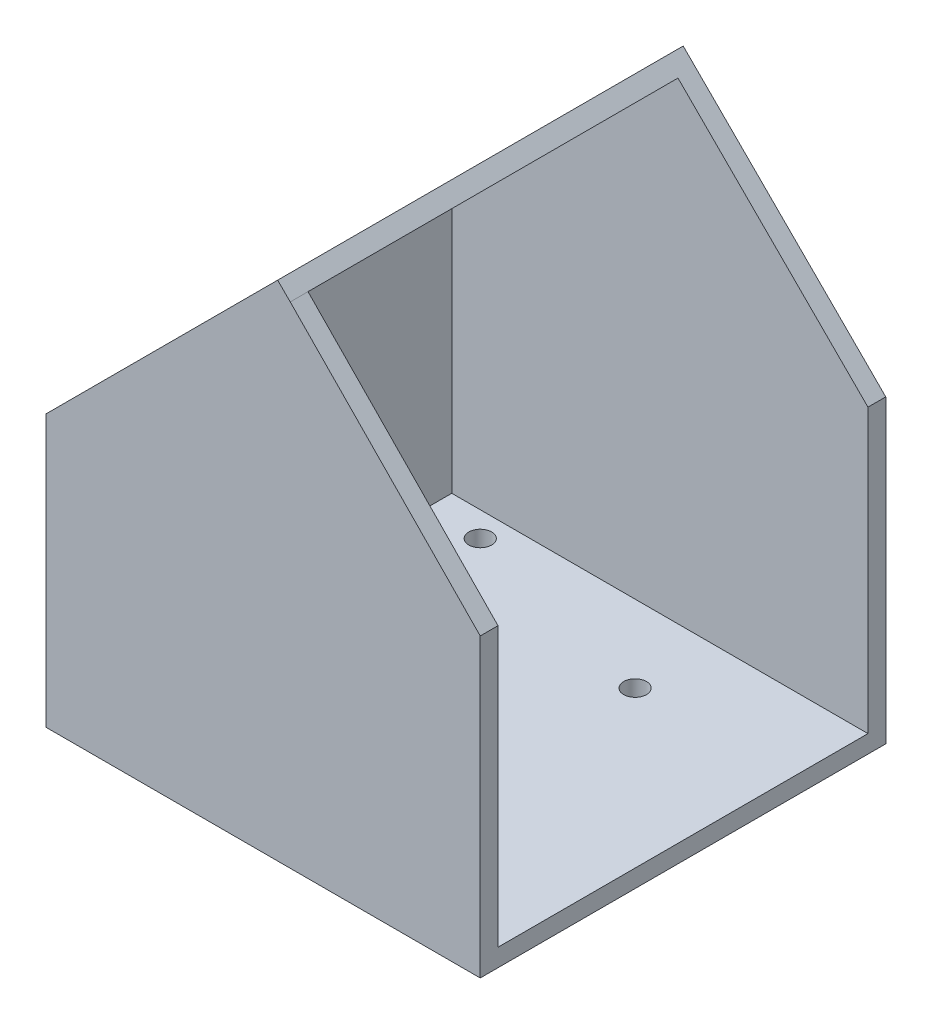
ISO-10303-21;
HEADER;
FILE_DESCRIPTION(('STEP AP214'),'2;1');
FILE_NAME('part.step','',(''),(''),'','','');
FILE_SCHEMA(('AUTOMOTIVE_DESIGN { 1 0 10303 214 1 1 1 1 }'));
ENDSEC;
DATA;
#1=APPLICATION_CONTEXT('core data for automotive mechanical design processes');
#2=APPLICATION_PROTOCOL_DEFINITION('international standard','automotive_design',2000,#1);
#3=PRODUCT_CONTEXT('',#1,'mechanical');
#4=PRODUCT('Part','Part','',(#3));
#5=PRODUCT_RELATED_PRODUCT_CATEGORY('part','',(#4));
#6=PRODUCT_DEFINITION_FORMATION('','',#4);
#7=PRODUCT_DEFINITION_CONTEXT('part definition',#1,'design');
#8=PRODUCT_DEFINITION('design','',#6,#7);
#9=PRODUCT_DEFINITION_SHAPE('','',#8);
#10=(LENGTH_UNIT() NAMED_UNIT(*) SI_UNIT(.MILLI.,.METRE.));
#11=(NAMED_UNIT(*) PLANE_ANGLE_UNIT() SI_UNIT($,.RADIAN.));
#12=(NAMED_UNIT(*) SI_UNIT($,.STERADIAN.) SOLID_ANGLE_UNIT());
#13=UNCERTAINTY_MEASURE_WITH_UNIT(LENGTH_MEASURE(1.E-05),#10,'distance_accuracy_value','');
#14=(GEOMETRIC_REPRESENTATION_CONTEXT(3) GLOBAL_UNCERTAINTY_ASSIGNED_CONTEXT((#13)) GLOBAL_UNIT_ASSIGNED_CONTEXT((#10,
#11,#12)) REPRESENTATION_CONTEXT('',''));
#15=CARTESIAN_POINT('',(0.,0.,0.));
#16=DIRECTION('',(0.,0.,1.));
#17=DIRECTION('',(1.,0.,0.));
#18=AXIS2_PLACEMENT_3D('',#15,#16,#17);
#19=CARTESIAN_POINT('',(32.5269119345812,70.7116104557177,52.));
#20=DIRECTION('',(-0.707106781186552,-0.707106781186543,0.));
#21=DIRECTION('',(0.707106781186543,-0.707106781186552,0.));
#22=AXIS2_PLACEMENT_3D('',#19,#20,#21);
#23=PLANE('',#22);
#24=DIRECTION('',(0.707106781186546,-0.707106781186549,0.));
#25=VECTOR('',#24,1.);
#26=CARTESIAN_POINT('',(100.738522390299,2.5,0.));
#27=LINE('',#26,#25);
#28=CARTESIAN_POINT('',(34.2946788875476,68.9438435027513,0.));
#29=VERTEX_POINT('',#28);
#30=CARTESIAN_POINT('',(61.,42.2385223902987,0.));
#31=VERTEX_POINT('',#30);
#32=EDGE_CURVE('E129',#29,#31,#27,.T.);
#33=ORIENTED_EDGE('',*,*,#32,.T.);
#34=DIRECTION('',(0.,0.,1.));
#35=VECTOR('',#34,1.);
#36=CARTESIAN_POINT('',(61.,42.2385223902987,-2.5));
#37=LINE('',#36,#35);
#38=CARTESIAN_POINT('',(61.,42.2385223902987,-2.5));
#39=VERTEX_POINT('',#38);
#40=EDGE_CURVE('E117',#39,#31,#37,.T.);
#41=ORIENTED_EDGE('',*,*,#40,.F.);
#42=DIRECTION('',(0.707106781186543,-0.707106781186552,0.));
#43=VECTOR('',#42,1.);
#44=CARTESIAN_POINT('',(34.2946788875476,68.9438435027514,-2.5));
#45=LINE('',#44,#43);
#46=CARTESIAN_POINT('',(32.5269119345812,70.7116104557177,-2.5));
#47=VERTEX_POINT('',#46);
#48=EDGE_CURVE('E127',#47,#39,#45,.T.);
#49=ORIENTED_EDGE('',*,*,#48,.F.);
#50=DIRECTION('',(0.,0.,-1.));
#51=VECTOR('',#50,1.);
#52=CARTESIAN_POINT('',(32.5269119345812,70.7116104557177,52.));
#53=LINE('',#52,#51);
#54=CARTESIAN_POINT('',(32.5269119345812,70.7116104557177,54.5));
#55=VERTEX_POINT('',#54);
#56=EDGE_CURVE('E11',#55,#47,#53,.T.);
#57=ORIENTED_EDGE('',*,*,#56,.F.);
#58=DIRECTION('',(-0.707106781186543,0.707106781186552,0.));
#59=VECTOR('',#58,1.);
#60=CARTESIAN_POINT('',(34.2946788875476,68.9438435027514,54.5));
#61=LINE('',#60,#59);
#62=CARTESIAN_POINT('',(34.2946788875476,68.9438435027514,54.5));
#63=VERTEX_POINT('',#62);
#64=EDGE_CURVE('E148',#63,#55,#61,.T.);
#65=ORIENTED_EDGE('',*,*,#64,.F.);
#66=DIRECTION('',(0.,0.,-1.));
#67=VECTOR('',#66,1.);
#68=CARTESIAN_POINT('',(34.2946788875476,68.9438435027514,54.5));
#69=LINE('',#68,#67);
#70=CARTESIAN_POINT('',(34.2946788875476,68.9438435027514,52.));
#71=VERTEX_POINT('',#70);
#72=EDGE_CURVE('E162',#63,#71,#69,.T.);
#73=ORIENTED_EDGE('',*,*,#72,.T.);
#74=DIRECTION('',(0.,0.,-1.));
#75=VECTOR('',#74,1.);
#76=CARTESIAN_POINT('',(34.2946788875476,68.9438435027514,52.));
#77=LINE('',#76,#75);
#78=EDGE_CURVE('E176',#71,#29,#77,.T.);
#79=ORIENTED_EDGE('',*,*,#78,.T.);
#80=EDGE_LOOP('',(#33,#41,#49,#57,#65,#73,#79));
#81=FACE_BOUND('',#80,.T.);
#82=ADVANCED_FACE('F35',(#81),#23,.F.);
#83=CARTESIAN_POINT('',(32.5269119345812,70.7116104557177,52.));
#84=DIRECTION('',(0.707106781186547,-0.707106781186548,0.));
#85=DIRECTION('',(0.707106781186548,0.707106781186547,0.));
#86=AXIS2_PLACEMENT_3D('',#83,#84,#85);
#87=PLANE('',#86);
#88=CARTESIAN_POINT('',(28.6378246380552,66.8225231591917,41.5));
#89=DIRECTION('',(-0.707106781186547,0.707106781186548,0.));
#90=DIRECTION('',(0.707106781186548,0.707106781186547,0.));
#91=AXIS2_PLACEMENT_3D('',#88,#89,#90);
#92=CIRCLE('',#91,1.60000000000001);
#93=CARTESIAN_POINT('',(29.7691954879537,67.9538940090902,41.5));
#94=VERTEX_POINT('',#93);
#95=EDGE_CURVE('E232',#94,#94,#92,.T.);
#96=ORIENTED_EDGE('',*,*,#95,.F.);
#97=EDGE_LOOP('',(#96));
#98=FACE_BOUND('',#97,.T.);
#99=CARTESIAN_POINT('',(6.71751442127218,44.9022129424088,10.5));
#100=DIRECTION('',(-0.707106781186547,0.707106781186548,0.));
#101=DIRECTION('',(-0.707106781186548,-0.707106781186547,0.));
#102=AXIS2_PLACEMENT_3D('',#99,#100,#101);
#103=CIRCLE('',#102,1.6);
#104=CARTESIAN_POINT('',(5.58614357137371,43.7708420925103,10.5));
#105=VERTEX_POINT('',#104);
#106=EDGE_CURVE('E228',#105,#105,#103,.T.);
#107=ORIENTED_EDGE('',*,*,#106,.F.);
#108=EDGE_LOOP('',(#107));
#109=FACE_BOUND('',#108,.T.);
#110=CARTESIAN_POINT('',(6.71751442127219,44.9022129424088,41.5));
#111=DIRECTION('',(-0.707106781186547,0.707106781186548,0.));
#112=DIRECTION('',(0.707106781186548,0.707106781186547,0.));
#113=AXIS2_PLACEMENT_3D('',#110,#111,#112);
#114=CIRCLE('',#113,1.6);
#115=CARTESIAN_POINT('',(7.84888527117066,46.0335837923073,41.5));
#116=VERTEX_POINT('',#115);
#117=EDGE_CURVE('E223',#116,#116,#114,.T.);
#118=ORIENTED_EDGE('',*,*,#117,.F.);
#119=EDGE_LOOP('',(#118));
#120=FACE_BOUND('',#119,.T.);
#121=CARTESIAN_POINT('',(17.6776695296637,55.8623680508002,26.));
#122=DIRECTION('',(-0.707106781186547,0.707106781186548,0.));
#123=DIRECTION('',(-0.707106781186548,-0.707106781186547,0.));
#124=AXIS2_PLACEMENT_3D('',#121,#122,#123);
#125=CIRCLE('',#124,12.5);
#126=CARTESIAN_POINT('',(8.83883476483182,47.0235332859684,26.));
#127=VERTEX_POINT('',#126);
#128=EDGE_CURVE('E219',#127,#127,#125,.T.);
#129=ORIENTED_EDGE('',*,*,#128,.F.);
#130=EDGE_LOOP('',(#129));
#131=FACE_BOUND('',#130,.T.);
#132=CARTESIAN_POINT('',(28.6378246380552,66.8225231591917,10.5));
#133=DIRECTION('',(-0.707106781186547,0.707106781186548,0.));
#134=DIRECTION('',(-0.707106781186548,-0.707106781186547,0.));
#135=AXIS2_PLACEMENT_3D('',#132,#133,#134);
#136=CIRCLE('',#135,1.60000000000001);
#137=CARTESIAN_POINT('',(27.5064537881567,65.6911523092932,10.5));
#138=VERTEX_POINT('',#137);
#139=EDGE_CURVE('E143',#138,#138,#136,.T.);
#140=ORIENTED_EDGE('',*,*,#139,.F.);
#141=EDGE_LOOP('',(#140));
#142=FACE_BOUND('',#141,.T.);
#143=ORIENTED_EDGE('',*,*,#56,.T.);
#144=DIRECTION('',(0.707106781186548,0.707106781186547,0.));
#145=VECTOR('',#144,1.);
#146=CARTESIAN_POINT('',(32.5269119345812,70.7116104557177,-2.5));
#147=LINE('',#146,#145);
#148=CARTESIAN_POINT('',(0.,38.1846985211366,-2.5));
#149=VERTEX_POINT('',#148);
#150=EDGE_CURVE('E135',#149,#47,#147,.T.);
#151=ORIENTED_EDGE('',*,*,#150,.F.);
#152=DIRECTION('',(0.,0.,-1.));
#153=VECTOR('',#152,1.);
#154=CARTESIAN_POINT('',(0.,38.1846985211366,52.));
#155=LINE('',#154,#153);
#156=CARTESIAN_POINT('',(0.,38.1846985211366,54.5));
#157=VERTEX_POINT('',#156);
#158=EDGE_CURVE('E43',#157,#149,#155,.T.);
#159=ORIENTED_EDGE('',*,*,#158,.F.);
#160=DIRECTION('',(-0.707106781186548,-0.707106781186547,0.));
#161=VECTOR('',#160,1.);
#162=CARTESIAN_POINT('',(32.5269119345812,70.7116104557177,54.5));
#163=LINE('',#162,#161);
#164=EDGE_CURVE('E151',#55,#157,#163,.T.);
#165=ORIENTED_EDGE('',*,*,#164,.F.);
#166=EDGE_LOOP('',(#143,#151,#159,#165));
#167=FACE_BOUND('',#166,.T.);
#168=ADVANCED_FACE('F240',(#98,#109,#120,#131,#142,#167),#87,.F.);
#169=CARTESIAN_POINT('',(0.,38.1846985211366,52.));
#170=DIRECTION('',(1.,0.,0.));
#171=DIRECTION('',(0.,1.,0.));
#172=AXIS2_PLACEMENT_3D('',#169,#170,#171);
#173=PLANE('',#172);
#174=ORIENTED_EDGE('',*,*,#158,.T.);
#175=DIRECTION('',(0.,1.,0.));
#176=VECTOR('',#175,1.);
#177=CARTESIAN_POINT('',(0.,38.1846985211366,-2.5));
#178=LINE('',#177,#176);
#179=CARTESIAN_POINT('',(0.,0.,-2.5));
#180=VERTEX_POINT('',#179);
#181=EDGE_CURVE('E138',#180,#149,#178,.T.);
#182=ORIENTED_EDGE('',*,*,#181,.F.);
#183=DIRECTION('',(0.,0.,-1.));
#184=VECTOR('',#183,1.);
#185=CARTESIAN_POINT('',(0.,0.,52.));
#186=LINE('',#185,#184);
#187=CARTESIAN_POINT('',(0.,0.,54.5));
#188=VERTEX_POINT('',#187);
#189=EDGE_CURVE('E190',#188,#180,#186,.T.);
#190=ORIENTED_EDGE('',*,*,#189,.F.);
#191=DIRECTION('',(0.,-1.,0.));
#192=VECTOR('',#191,1.);
#193=CARTESIAN_POINT('',(0.,38.1846985211366,54.5));
#194=LINE('',#193,#192);
#195=EDGE_CURVE('E154',#157,#188,#194,.T.);
#196=ORIENTED_EDGE('',*,*,#195,.F.);
#197=EDGE_LOOP('',(#174,#182,#190,#196));
#198=FACE_BOUND('',#197,.T.);
#199=ADVANCED_FACE('F243',(#198),#173,.F.);
#200=CARTESIAN_POINT('',(0.,0.,52.));
#201=DIRECTION('',(0.,1.,0.));
#202=DIRECTION('',(-1.,0.,0.));
#203=AXIS2_PLACEMENT_3D('',#200,#201,#202);
#204=PLANE('',#203);
#205=CARTESIAN_POINT('',(10.,0.,48.5));
#206=DIRECTION('',(0.,-1.,0.));
#207=DIRECTION('',(0.,0.,-1.));
#208=AXIS2_PLACEMENT_3D('',#205,#206,#207);
#209=CIRCLE('',#208,1.6);
#210=CARTESIAN_POINT('',(10.,0.,46.9));
#211=VERTEX_POINT('',#210);
#212=EDGE_CURVE('E212',#211,#211,#209,.T.);
#213=ORIENTED_EDGE('',*,*,#212,.F.);
#214=EDGE_LOOP('',(#213));
#215=FACE_BOUND('',#214,.T.);
#216=CARTESIAN_POINT('',(39.0925564857225,0.,10.8227834274302));
#217=DIRECTION('',(0.,-1.,0.));
#218=DIRECTION('',(0.,0.,1.));
#219=AXIS2_PLACEMENT_3D('',#216,#217,#218);
#220=CIRCLE('',#219,1.6);
#221=CARTESIAN_POINT('',(39.0925564857225,0.,12.4227834274302));
#222=VERTEX_POINT('',#221);
#223=EDGE_CURVE('E470',#222,#222,#220,.T.);
#224=ORIENTED_EDGE('',*,*,#223,.F.);
#225=EDGE_LOOP('',(#224));
#226=FACE_BOUND('',#225,.T.);
#227=CARTESIAN_POINT('',(39.0925564857225,0.,41.1772165725698));
#228=DIRECTION('',(0.,-1.,0.));
#229=DIRECTION('',(0.,0.,-1.));
#230=AXIS2_PLACEMENT_3D('',#227,#228,#229);
#231=CIRCLE('',#230,1.6);
#232=CARTESIAN_POINT('',(39.0925564857225,0.,39.5772165725698));
#233=VERTEX_POINT('',#232);
#234=EDGE_CURVE('E476',#233,#233,#231,.T.);
#235=ORIENTED_EDGE('',*,*,#234,.F.);
#236=EDGE_LOOP('',(#235));
#237=FACE_BOUND('',#236,.T.);
#238=CARTESIAN_POINT('',(10.,0.,3.5));
#239=DIRECTION('',(0.,-1.,0.));
#240=DIRECTION('',(0.,0.,1.));
#241=AXIS2_PLACEMENT_3D('',#238,#239,#240);
#242=CIRCLE('',#241,1.6);
#243=CARTESIAN_POINT('',(10.,0.,5.1));
#244=VERTEX_POINT('',#243);
#245=EDGE_CURVE('E473',#244,#244,#242,.T.);
#246=ORIENTED_EDGE('',*,*,#245,.F.);
#247=EDGE_LOOP('',(#246));
#248=FACE_BOUND('',#247,.T.);
#249=DIRECTION('',(-1.,0.,0.));
#250=VECTOR('',#249,1.);
#251=CARTESIAN_POINT('',(0.,0.,-2.5));
#252=LINE('',#251,#250);
#253=CARTESIAN_POINT('',(61.,0.,-2.5));
#254=VERTEX_POINT('',#253);
#255=EDGE_CURVE('E136',#254,#180,#252,.T.);
#256=ORIENTED_EDGE('',*,*,#255,.F.);
#257=DIRECTION('',(0.,0.,1.));
#258=VECTOR('',#257,1.);
#259=CARTESIAN_POINT('',(61.,0.,-2.5));
#260=LINE('',#259,#258);
#261=CARTESIAN_POINT('',(61.,0.,54.5));
#262=VERTEX_POINT('',#261);
#263=EDGE_CURVE('E51',#254,#262,#260,.T.);
#264=ORIENTED_EDGE('',*,*,#263,.T.);
#265=DIRECTION('',(1.,0.,0.));
#266=VECTOR('',#265,1.);
#267=CARTESIAN_POINT('',(0.,0.,54.5));
#268=LINE('',#267,#266);
#269=EDGE_CURVE('E157',#188,#262,#268,.T.);
#270=ORIENTED_EDGE('',*,*,#269,.F.);
#271=ORIENTED_EDGE('',*,*,#189,.T.);
#272=EDGE_LOOP('',(#256,#264,#270,#271));
#273=FACE_BOUND('',#272,.T.);
#274=ADVANCED_FACE('F289',(#215,#226,#237,#248,#273),#204,.F.);
#275=CARTESIAN_POINT('',(2.5,2.5,52.));
#276=DIRECTION('',(0.,-1.,0.));
#277=DIRECTION('',(0.,0.,-1.));
#278=AXIS2_PLACEMENT_3D('',#275,#276,#277);
#279=PLANE('',#278);
#280=CARTESIAN_POINT('',(10.,2.5,48.5));
#281=DIRECTION('',(0.,-1.,0.));
#282=DIRECTION('',(0.,0.,-1.));
#283=AXIS2_PLACEMENT_3D('',#280,#281,#282);
#284=CIRCLE('',#283,1.6);
#285=CARTESIAN_POINT('',(10.,2.5,46.9));
#286=VERTEX_POINT('',#285);
#287=EDGE_CURVE('E38',#286,#286,#284,.T.);
#288=ORIENTED_EDGE('',*,*,#287,.T.);
#289=EDGE_LOOP('',(#288));
#290=FACE_BOUND('',#289,.T.);
#291=CARTESIAN_POINT('',(39.0925564857225,2.5,10.8227834274302));
#292=DIRECTION('',(0.,-1.,0.));
#293=DIRECTION('',(0.,0.,-1.));
#294=AXIS2_PLACEMENT_3D('',#291,#292,#293);
#295=CIRCLE('',#294,1.6);
#296=CARTESIAN_POINT('',(39.0925564857225,2.5,9.22278342743024));
#297=VERTEX_POINT('',#296);
#298=EDGE_CURVE('E214',#297,#297,#295,.T.);
#299=ORIENTED_EDGE('',*,*,#298,.T.);
#300=EDGE_LOOP('',(#299));
#301=FACE_BOUND('',#300,.T.);
#302=CARTESIAN_POINT('',(39.0925564857225,2.5,41.1772165725698));
#303=DIRECTION('',(0.,-1.,0.));
#304=DIRECTION('',(0.,0.,-1.));
#305=AXIS2_PLACEMENT_3D('',#302,#303,#304);
#306=CIRCLE('',#305,1.6);
#307=CARTESIAN_POINT('',(39.0925564857225,2.5,39.5772165725698));
#308=VERTEX_POINT('',#307);
#309=EDGE_CURVE('E211',#308,#308,#306,.T.);
#310=ORIENTED_EDGE('',*,*,#309,.T.);
#311=EDGE_LOOP('',(#310));
#312=FACE_BOUND('',#311,.T.);
#313=CARTESIAN_POINT('',(10.,2.5,3.5));
#314=DIRECTION('',(0.,-1.,0.));
#315=DIRECTION('',(0.,0.,-1.));
#316=AXIS2_PLACEMENT_3D('',#313,#314,#315);
#317=CIRCLE('',#316,1.6);
#318=CARTESIAN_POINT('',(10.,2.5,1.9));
#319=VERTEX_POINT('',#318);
#320=EDGE_CURVE('E208',#319,#319,#317,.T.);
#321=ORIENTED_EDGE('',*,*,#320,.T.);
#322=EDGE_LOOP('',(#321));
#323=FACE_BOUND('',#322,.T.);
#324=DIRECTION('',(-1.,0.,0.));
#325=VECTOR('',#324,1.);
#326=CARTESIAN_POINT('',(100.738522390299,2.5,52.));
#327=LINE('',#326,#325);
#328=CARTESIAN_POINT('',(61.,2.5,52.));
#329=VERTEX_POINT('',#328);
#330=CARTESIAN_POINT('',(2.5,2.5,52.));
#331=VERTEX_POINT('',#330);
#332=EDGE_CURVE('E167',#329,#331,#327,.T.);
#333=ORIENTED_EDGE('',*,*,#332,.F.);
#334=DIRECTION('',(0.,0.,-1.));
#335=VECTOR('',#334,1.);
#336=CARTESIAN_POINT('',(61.,2.5,52.));
#337=LINE('',#336,#335);
#338=CARTESIAN_POINT('',(61.,2.5,0.));
#339=VERTEX_POINT('',#338);
#340=EDGE_CURVE('E459',#329,#339,#337,.T.);
#341=ORIENTED_EDGE('',*,*,#340,.T.);
#342=DIRECTION('',(-1.,0.,0.));
#343=VECTOR('',#342,1.);
#344=CARTESIAN_POINT('',(2.5,2.5,0.));
#345=LINE('',#344,#343);
#346=CARTESIAN_POINT('',(2.5,2.5,0.));
#347=VERTEX_POINT('',#346);
#348=EDGE_CURVE('E166',#339,#347,#345,.T.);
#349=ORIENTED_EDGE('',*,*,#348,.T.);
#350=DIRECTION('',(0.,0.,-1.));
#351=VECTOR('',#350,1.);
#352=CARTESIAN_POINT('',(2.5,2.5,52.));
#353=LINE('',#352,#351);
#354=EDGE_CURVE('E187',#331,#347,#353,.T.);
#355=ORIENTED_EDGE('',*,*,#354,.F.);
#356=EDGE_LOOP('',(#333,#341,#349,#355));
#357=FACE_BOUND('',#356,.T.);
#358=ADVANCED_FACE('F296',(#290,#301,#312,#323,#357),#279,.F.);
#359=CARTESIAN_POINT('',(2.5,37.1491646152038,52.));
#360=DIRECTION('',(-1.,0.,0.));
#361=DIRECTION('',(0.,-1.,0.));
#362=AXIS2_PLACEMENT_3D('',#359,#360,#361);
#363=PLANE('',#362);
#364=DIRECTION('',(0.,1.,0.));
#365=VECTOR('',#364,1.);
#366=CARTESIAN_POINT('',(2.5,37.1491646152038,0.));
#367=LINE('',#366,#365);
#368=CARTESIAN_POINT('',(2.5,37.1491646152038,0.));
#369=VERTEX_POINT('',#368);
#370=EDGE_CURVE('E178',#347,#369,#367,.T.);
#371=ORIENTED_EDGE('',*,*,#370,.T.);
#372=DIRECTION('',(0.,0.,-1.));
#373=VECTOR('',#372,1.);
#374=CARTESIAN_POINT('',(2.5,37.1491646152038,52.));
#375=LINE('',#374,#373);
#376=CARTESIAN_POINT('',(2.5,37.1491646152038,52.));
#377=VERTEX_POINT('',#376);
#378=EDGE_CURVE('E184',#377,#369,#375,.T.);
#379=ORIENTED_EDGE('',*,*,#378,.F.);
#380=DIRECTION('',(0.,1.,0.));
#381=VECTOR('',#380,1.);
#382=CARTESIAN_POINT('',(2.5,37.1491646152038,52.));
#383=LINE('',#382,#381);
#384=EDGE_CURVE('E169',#331,#377,#383,.T.);
#385=ORIENTED_EDGE('',*,*,#384,.F.);
#386=ORIENTED_EDGE('',*,*,#354,.T.);
#387=EDGE_LOOP('',(#371,#379,#385,#386));
#388=FACE_BOUND('',#387,.T.);
#389=ADVANCED_FACE('F304',(#388),#363,.F.);
#390=CARTESIAN_POINT('',(34.2946788875476,68.9438435027514,52.));
#391=DIRECTION('',(-0.707106781186549,0.707106781186546,0.));
#392=DIRECTION('',(-0.707106781186546,-0.707106781186549,0.));
#393=AXIS2_PLACEMENT_3D('',#390,#391,#392);
#394=PLANE('',#393);
#395=CARTESIAN_POINT('',(30.4055915910216,65.0547562062253,41.5));
#396=DIRECTION('',(-0.707106781186549,0.707106781186546,0.));
#397=DIRECTION('',(-0.707106781186546,-0.707106781186549,0.));
#398=AXIS2_PLACEMENT_3D('',#395,#396,#397);
#399=CIRCLE('',#398,1.60000000000001);
#400=CARTESIAN_POINT('',(29.2742207411231,63.9233853563269,41.5));
#401=VERTEX_POINT('',#400);
#402=EDGE_CURVE('E140',#401,#401,#399,.T.);
#403=ORIENTED_EDGE('',*,*,#402,.T.);
#404=EDGE_LOOP('',(#403));
#405=FACE_BOUND('',#404,.T.);
#406=CARTESIAN_POINT('',(8.48528137423864,43.1344459894423,10.5));
#407=DIRECTION('',(-0.707106781186549,0.707106781186546,0.));
#408=DIRECTION('',(-0.707106781186546,-0.707106781186549,0.));
#409=AXIS2_PLACEMENT_3D('',#406,#407,#408);
#410=CIRCLE('',#409,1.6);
#411=CARTESIAN_POINT('',(7.35391052434016,42.0030751395438,10.5));
#412=VERTEX_POINT('',#411);
#413=EDGE_CURVE('E203',#412,#412,#410,.T.);
#414=ORIENTED_EDGE('',*,*,#413,.T.);
#415=EDGE_LOOP('',(#414));
#416=FACE_BOUND('',#415,.T.);
#417=CARTESIAN_POINT('',(8.48528137423865,43.1344459894423,41.5));
#418=DIRECTION('',(-0.707106781186549,0.707106781186546,0.));
#419=DIRECTION('',(-0.707106781186546,-0.707106781186549,0.));
#420=AXIS2_PLACEMENT_3D('',#417,#418,#419);
#421=CIRCLE('',#420,1.6);
#422=CARTESIAN_POINT('',(7.35391052434017,42.0030751395439,41.5));
#423=VERTEX_POINT('',#422);
#424=EDGE_CURVE('E200',#423,#423,#421,.T.);
#425=ORIENTED_EDGE('',*,*,#424,.T.);
#426=EDGE_LOOP('',(#425));
#427=FACE_BOUND('',#426,.T.);
#428=CARTESIAN_POINT('',(19.4454364826301,54.0946010978338,26.));
#429=DIRECTION('',(-0.707106781186549,0.707106781186546,0.));
#430=DIRECTION('',(-0.707106781186546,-0.707106781186549,0.));
#431=AXIS2_PLACEMENT_3D('',#428,#429,#430);
#432=CIRCLE('',#431,12.5);
#433=CARTESIAN_POINT('',(10.6066017177983,45.255766333002,26.));
#434=VERTEX_POINT('',#433);
#435=EDGE_CURVE('E197',#434,#434,#432,.T.);
#436=ORIENTED_EDGE('',*,*,#435,.T.);
#437=EDGE_LOOP('',(#436));
#438=FACE_BOUND('',#437,.T.);
#439=CARTESIAN_POINT('',(30.4055915910216,65.0547562062253,10.5));
#440=DIRECTION('',(-0.707106781186549,0.707106781186546,0.));
#441=DIRECTION('',(-0.707106781186546,-0.707106781186549,0.));
#442=AXIS2_PLACEMENT_3D('',#439,#440,#441);
#443=CIRCLE('',#442,1.60000000000001);
#444=CARTESIAN_POINT('',(29.2742207411231,63.9233853563269,10.5));
#445=VERTEX_POINT('',#444);
#446=EDGE_CURVE('E194',#445,#445,#443,.T.);
#447=ORIENTED_EDGE('',*,*,#446,.T.);
#448=EDGE_LOOP('',(#447));
#449=FACE_BOUND('',#448,.T.);
#450=DIRECTION('',(0.707106781186546,0.707106781186549,0.));
#451=VECTOR('',#450,1.);
#452=CARTESIAN_POINT('',(34.2946788875476,68.9438435027514,0.));
#453=LINE('',#452,#451);
#454=EDGE_CURVE('E170',#369,#29,#453,.T.);
#455=ORIENTED_EDGE('',*,*,#454,.T.);
#456=ORIENTED_EDGE('',*,*,#78,.F.);
#457=DIRECTION('',(0.707106781186548,0.707106781186547,0.));
#458=VECTOR('',#457,1.);
#459=CARTESIAN_POINT('',(32.4948137794906,67.1439783946944,52.));
#460=LINE('',#459,#458);
#461=EDGE_CURVE('E173',#377,#71,#460,.T.);
#462=ORIENTED_EDGE('',*,*,#461,.F.);
#463=ORIENTED_EDGE('',*,*,#378,.T.);
#464=EDGE_LOOP('',(#455,#456,#462,#463));
#465=FACE_BOUND('',#464,.T.);
#466=ADVANCED_FACE('F268',(#405,#416,#427,#438,#449,#465),#394,.F.);
#467=CARTESIAN_POINT('',(0.,0.,52.));
#468=DIRECTION('',(0.,0.,1.));
#469=DIRECTION('',(1.,0.,0.));
#470=AXIS2_PLACEMENT_3D('',#467,#468,#469);
#471=PLANE('',#470);
#472=DIRECTION('',(-0.699170689847336,0.714954786303582,0.));
#473=VECTOR('',#472,1.);
#474=CARTESIAN_POINT('',(100.738522390299,1.,52.));
#475=LINE('',#474,#473);
#476=CARTESIAN_POINT('',(61.,41.6356376148716,52.));
#477=VERTEX_POINT('',#476);
#478=EDGE_CURVE('E59',#477,#71,#475,.T.);
#479=ORIENTED_EDGE('',*,*,#478,.F.);
#480=DIRECTION('',(0.,-1.,0.));
#481=VECTOR('',#480,1.);
#482=CARTESIAN_POINT('',(61.,0.,52.));
#483=LINE('',#482,#481);
#484=EDGE_CURVE('E462',#477,#329,#483,.T.);
#485=ORIENTED_EDGE('',*,*,#484,.T.);
#486=ORIENTED_EDGE('',*,*,#332,.T.);
#487=ORIENTED_EDGE('',*,*,#384,.T.);
#488=ORIENTED_EDGE('',*,*,#461,.T.);
#489=EDGE_LOOP('',(#479,#485,#486,#487,#488));
#490=FACE_BOUND('',#489,.T.);
#491=ADVANCED_FACE('F260',(#490),#471,.F.);
#492=CARTESIAN_POINT('',(100.738522390299,1.,54.5));
#493=DIRECTION('',(-0.714954786303582,-0.699170689847336,0.));
#494=DIRECTION('',(0.699170689847336,-0.714954786303582,0.));
#495=AXIS2_PLACEMENT_3D('',#492,#493,#494);
#496=PLANE('',#495);
#497=DIRECTION('',(-0.699170689847336,0.714954786303582,0.));
#498=VECTOR('',#497,1.);
#499=CARTESIAN_POINT('',(100.738522390299,1.,54.5));
#500=LINE('',#499,#498);
#501=CARTESIAN_POINT('',(61.,41.6356376148716,54.5));
#502=VERTEX_POINT('',#501);
#503=EDGE_CURVE('E160',#502,#63,#500,.T.);
#504=ORIENTED_EDGE('',*,*,#503,.F.);
#505=DIRECTION('',(0.,0.,-1.));
#506=VECTOR('',#505,1.);
#507=CARTESIAN_POINT('',(61.,41.6356376148716,54.5));
#508=LINE('',#507,#506);
#509=EDGE_CURVE('E468',#502,#477,#508,.T.);
#510=ORIENTED_EDGE('',*,*,#509,.T.);
#511=ORIENTED_EDGE('',*,*,#478,.T.);
#512=ORIENTED_EDGE('',*,*,#72,.F.);
#513=EDGE_LOOP('',(#504,#510,#511,#512));
#514=FACE_BOUND('',#513,.T.);
#515=ADVANCED_FACE('F258',(#514),#496,.F.);
#516=CARTESIAN_POINT('',(0.,0.,54.5));
#517=DIRECTION('',(0.,0.,1.));
#518=DIRECTION('',(1.,0.,0.));
#519=AXIS2_PLACEMENT_3D('',#516,#517,#518);
#520=PLANE('',#519);
#521=DIRECTION('',(0.,-1.,0.));
#522=VECTOR('',#521,1.);
#523=CARTESIAN_POINT('',(61.,42.2385223902987,54.5));
#524=LINE('',#523,#522);
#525=EDGE_CURVE('E122',#502,#262,#524,.T.);
#526=ORIENTED_EDGE('',*,*,#525,.F.);
#527=ORIENTED_EDGE('',*,*,#503,.T.);
#528=ORIENTED_EDGE('',*,*,#64,.T.);
#529=ORIENTED_EDGE('',*,*,#164,.T.);
#530=ORIENTED_EDGE('',*,*,#195,.T.);
#531=ORIENTED_EDGE('',*,*,#269,.T.);
#532=EDGE_LOOP('',(#526,#527,#528,#529,#530,#531));
#533=FACE_BOUND('',#532,.T.);
#534=ADVANCED_FACE('F255',(#533),#520,.T.);
#535=CARTESIAN_POINT('',(0.,0.,0.));
#536=DIRECTION('',(0.,0.,1.));
#537=DIRECTION('',(1.,0.,0.));
#538=AXIS2_PLACEMENT_3D('',#535,#536,#537);
#539=PLANE('',#538);
#540=DIRECTION('',(0.,-1.,0.));
#541=VECTOR('',#540,1.);
#542=CARTESIAN_POINT('',(61.,0.,0.));
#543=LINE('',#542,#541);
#544=EDGE_CURVE('E460',#31,#339,#543,.T.);
#545=ORIENTED_EDGE('',*,*,#544,.F.);
#546=ORIENTED_EDGE('',*,*,#32,.F.);
#547=ORIENTED_EDGE('',*,*,#454,.F.);
#548=ORIENTED_EDGE('',*,*,#370,.F.);
#549=ORIENTED_EDGE('',*,*,#348,.F.);
#550=EDGE_LOOP('',(#545,#546,#547,#548,#549));
#551=FACE_BOUND('',#550,.T.);
#552=ADVANCED_FACE('F266',(#551),#539,.T.);
#553=CARTESIAN_POINT('',(0.,0.,-2.5));
#554=DIRECTION('',(0.,0.,1.));
#555=DIRECTION('',(1.,0.,0.));
#556=AXIS2_PLACEMENT_3D('',#553,#554,#555);
#557=PLANE('',#556);
#558=ORIENTED_EDGE('',*,*,#48,.T.);
#559=DIRECTION('',(0.,-1.,0.));
#560=VECTOR('',#559,1.);
#561=CARTESIAN_POINT('',(61.,42.2385223902987,-2.5));
#562=LINE('',#561,#560);
#563=EDGE_CURVE('E114',#39,#254,#562,.T.);
#564=ORIENTED_EDGE('',*,*,#563,.T.);
#565=ORIENTED_EDGE('',*,*,#255,.T.);
#566=ORIENTED_EDGE('',*,*,#181,.T.);
#567=ORIENTED_EDGE('',*,*,#150,.T.);
#568=EDGE_LOOP('',(#558,#564,#565,#566,#567));
#569=FACE_BOUND('',#568,.T.);
#570=ADVANCED_FACE('F132',(#569),#557,.F.);
#571=CARTESIAN_POINT('',(32.1733585439879,63.286989253259,10.5));
#572=DIRECTION('',(-0.707106781186547,0.707106781186548,0.));
#573=DIRECTION('',(-0.707106781186548,-0.707106781186547,0.));
#574=AXIS2_PLACEMENT_3D('',#571,#572,#573);
#575=CYLINDRICAL_SURFACE('',#574,1.60000000000001);
#576=ORIENTED_EDGE('',*,*,#139,.T.);
#577=EDGE_LOOP('',(#576));
#578=FACE_BOUND('',#577,.T.);
#579=ORIENTED_EDGE('',*,*,#446,.F.);
#580=EDGE_LOOP('',(#579));
#581=FACE_BOUND('',#580,.T.);
#582=ADVANCED_FACE('F351',(#578,#581),#575,.F.);
#583=CARTESIAN_POINT('',(21.2132034355964,52.3268341448675,26.));
#584=DIRECTION('',(-0.707106781186547,0.707106781186548,0.));
#585=DIRECTION('',(-0.707106781186548,-0.707106781186547,0.));
#586=AXIS2_PLACEMENT_3D('',#583,#584,#585);
#587=CYLINDRICAL_SURFACE('',#586,12.5);
#588=ORIENTED_EDGE('',*,*,#128,.T.);
#589=EDGE_LOOP('',(#588));
#590=FACE_BOUND('',#589,.T.);
#591=ORIENTED_EDGE('',*,*,#435,.F.);
#592=EDGE_LOOP('',(#591));
#593=FACE_BOUND('',#592,.T.);
#594=ADVANCED_FACE('F415',(#590,#593),#587,.F.);
#595=CARTESIAN_POINT('',(10.2530483272049,41.3666790364761,41.5));
#596=DIRECTION('',(-0.707106781186547,0.707106781186548,0.));
#597=DIRECTION('',(-0.707106781186548,-0.707106781186547,0.));
#598=AXIS2_PLACEMENT_3D('',#595,#596,#597);
#599=CYLINDRICAL_SURFACE('',#598,1.6);
#600=ORIENTED_EDGE('',*,*,#117,.T.);
#601=EDGE_LOOP('',(#600));
#602=FACE_BOUND('',#601,.T.);
#603=ORIENTED_EDGE('',*,*,#424,.F.);
#604=EDGE_LOOP('',(#603));
#605=FACE_BOUND('',#604,.T.);
#606=ADVANCED_FACE('F408',(#602,#605),#599,.F.);
#607=CARTESIAN_POINT('',(10.2530483272049,41.366679036476,10.5));
#608=DIRECTION('',(-0.707106781186547,0.707106781186548,0.));
#609=DIRECTION('',(-0.707106781186548,-0.707106781186547,0.));
#610=AXIS2_PLACEMENT_3D('',#607,#608,#609);
#611=CYLINDRICAL_SURFACE('',#610,1.6);
#612=ORIENTED_EDGE('',*,*,#106,.T.);
#613=EDGE_LOOP('',(#612));
#614=FACE_BOUND('',#613,.T.);
#615=ORIENTED_EDGE('',*,*,#413,.F.);
#616=EDGE_LOOP('',(#615));
#617=FACE_BOUND('',#616,.T.);
#618=ADVANCED_FACE('F237',(#614,#617),#611,.F.);
#619=CARTESIAN_POINT('',(32.1733585439879,63.286989253259,41.5));
#620=DIRECTION('',(-0.707106781186547,0.707106781186548,0.));
#621=DIRECTION('',(-0.707106781186548,-0.707106781186547,0.));
#622=AXIS2_PLACEMENT_3D('',#619,#620,#621);
#623=CYLINDRICAL_SURFACE('',#622,1.60000000000001);
#624=ORIENTED_EDGE('',*,*,#95,.T.);
#625=EDGE_LOOP('',(#624));
#626=FACE_BOUND('',#625,.T.);
#627=ORIENTED_EDGE('',*,*,#402,.F.);
#628=EDGE_LOOP('',(#627));
#629=FACE_BOUND('',#628,.T.);
#630=ADVANCED_FACE('F393',(#626,#629),#623,.F.);
#631=CARTESIAN_POINT('',(10.,5.,3.5));
#632=DIRECTION('',(0.,-1.,0.));
#633=DIRECTION('',(0.,0.,-1.));
#634=AXIS2_PLACEMENT_3D('',#631,#632,#633);
#635=CYLINDRICAL_SURFACE('',#634,1.6);
#636=ORIENTED_EDGE('',*,*,#245,.T.);
#637=EDGE_LOOP('',(#636));
#638=FACE_BOUND('',#637,.T.);
#639=ORIENTED_EDGE('',*,*,#320,.F.);
#640=EDGE_LOOP('',(#639));
#641=FACE_BOUND('',#640,.T.);
#642=ADVANCED_FACE('F385',(#638,#641),#635,.F.);
#643=CARTESIAN_POINT('',(39.0925564857225,5.,41.1772165725698));
#644=DIRECTION('',(0.,-1.,0.));
#645=DIRECTION('',(0.,0.,-1.));
#646=AXIS2_PLACEMENT_3D('',#643,#644,#645);
#647=CYLINDRICAL_SURFACE('',#646,1.6);
#648=ORIENTED_EDGE('',*,*,#234,.T.);
#649=EDGE_LOOP('',(#648));
#650=FACE_BOUND('',#649,.T.);
#651=ORIENTED_EDGE('',*,*,#309,.F.);
#652=EDGE_LOOP('',(#651));
#653=FACE_BOUND('',#652,.T.);
#654=ADVANCED_FACE('F377',(#650,#653),#647,.F.);
#655=CARTESIAN_POINT('',(39.0925564857225,5.,10.8227834274302));
#656=DIRECTION('',(0.,-1.,0.));
#657=DIRECTION('',(0.,0.,-1.));
#658=AXIS2_PLACEMENT_3D('',#655,#656,#657);
#659=CYLINDRICAL_SURFACE('',#658,1.6);
#660=ORIENTED_EDGE('',*,*,#223,.T.);
#661=EDGE_LOOP('',(#660));
#662=FACE_BOUND('',#661,.T.);
#663=ORIENTED_EDGE('',*,*,#298,.F.);
#664=EDGE_LOOP('',(#663));
#665=FACE_BOUND('',#664,.T.);
#666=ADVANCED_FACE('F370',(#662,#665),#659,.F.);
#667=CARTESIAN_POINT('',(10.,5.,48.5));
#668=DIRECTION('',(0.,-1.,0.));
#669=DIRECTION('',(0.,0.,-1.));
#670=AXIS2_PLACEMENT_3D('',#667,#668,#669);
#671=CYLINDRICAL_SURFACE('',#670,1.6);
#672=ORIENTED_EDGE('',*,*,#212,.T.);
#673=EDGE_LOOP('',(#672));
#674=FACE_BOUND('',#673,.T.);
#675=ORIENTED_EDGE('',*,*,#287,.F.);
#676=EDGE_LOOP('',(#675));
#677=FACE_BOUND('',#676,.T.);
#678=ADVANCED_FACE('F361',(#674,#677),#671,.F.);
#679=CARTESIAN_POINT('',(61.,42.2385223902987,-2.5));
#680=DIRECTION('',(-1.,0.,0.));
#681=DIRECTION('',(0.,-1.,0.));
#682=AXIS2_PLACEMENT_3D('',#679,#680,#681);
#683=PLANE('',#682);
#684=ORIENTED_EDGE('',*,*,#525,.T.);
#685=ORIENTED_EDGE('',*,*,#263,.F.);
#686=ORIENTED_EDGE('',*,*,#563,.F.);
#687=ORIENTED_EDGE('',*,*,#40,.T.);
#688=ORIENTED_EDGE('',*,*,#544,.T.);
#689=ORIENTED_EDGE('',*,*,#340,.F.);
#690=ORIENTED_EDGE('',*,*,#484,.F.);
#691=ORIENTED_EDGE('',*,*,#509,.F.);
#692=EDGE_LOOP('',(#684,#685,#686,#687,#688,#689,#690,#691));
#693=FACE_BOUND('',#692,.T.);
#694=ADVANCED_FACE('F116',(#693),#683,.F.);
#695=CLOSED_SHELL('',(#82,#168,#199,#274,#358,#389,#466,#491,#515,#534,#552,#570,#582,#594,#606,
#618,#630,#642,#654,#666,#678,#694));
#696=MANIFOLD_SOLID_BREP('B2',#695);
#697=ADVANCED_BREP_SHAPE_REPRESENTATION('',(#18,#696),#14);
#698=SHAPE_DEFINITION_REPRESENTATION(#9,#697);
ENDSEC;
END-ISO-10303-21;
